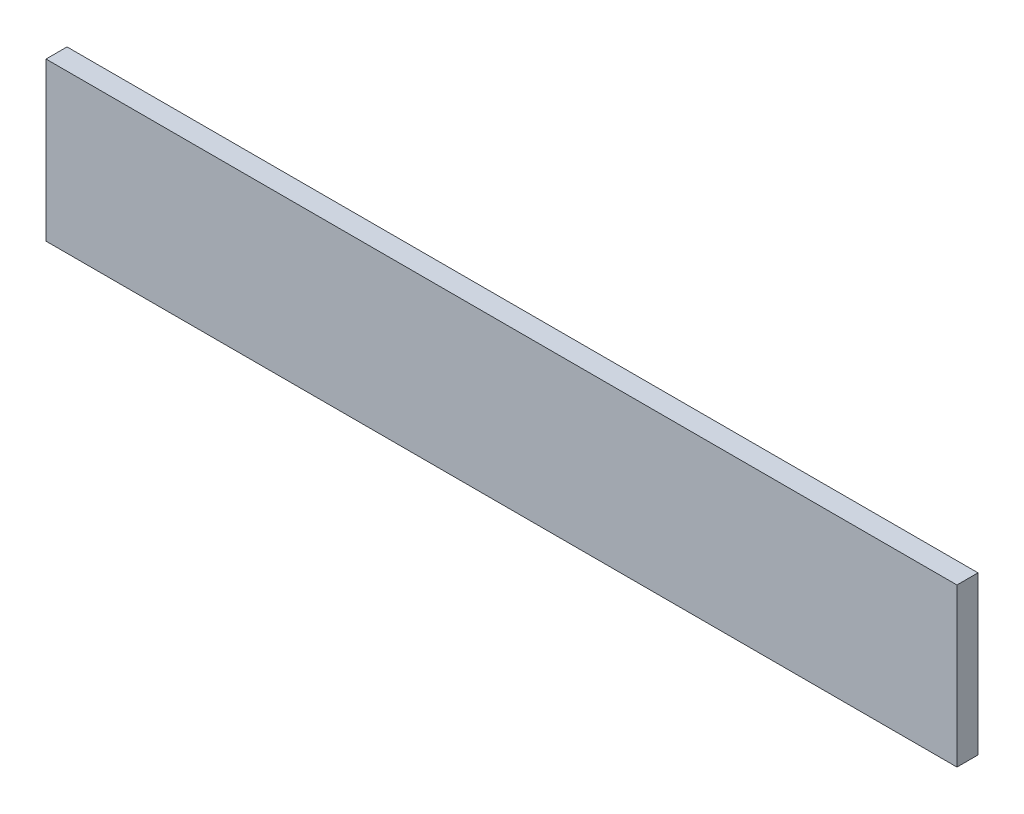
ISO-10303-21;
HEADER;
FILE_DESCRIPTION(('STEP AP214'),'2;1');
FILE_NAME('part.step','',(''),(''),'','','');
FILE_SCHEMA(('AUTOMOTIVE_DESIGN { 1 0 10303 214 1 1 1 1 }'));
ENDSEC;
DATA;
#1=APPLICATION_CONTEXT('core data for automotive mechanical design processes');
#2=APPLICATION_PROTOCOL_DEFINITION('international standard','automotive_design',2000,#1);
#3=PRODUCT_CONTEXT('',#1,'mechanical');
#4=PRODUCT('Part','Part','',(#3));
#5=PRODUCT_RELATED_PRODUCT_CATEGORY('part','',(#4));
#6=PRODUCT_DEFINITION_FORMATION('','',#4);
#7=PRODUCT_DEFINITION_CONTEXT('part definition',#1,'design');
#8=PRODUCT_DEFINITION('design','',#6,#7);
#9=PRODUCT_DEFINITION_SHAPE('','',#8);
#10=(LENGTH_UNIT() NAMED_UNIT(*) SI_UNIT(.MILLI.,.METRE.));
#11=(NAMED_UNIT(*) PLANE_ANGLE_UNIT() SI_UNIT($,.RADIAN.));
#12=(NAMED_UNIT(*) SI_UNIT($,.STERADIAN.) SOLID_ANGLE_UNIT());
#13=UNCERTAINTY_MEASURE_WITH_UNIT(LENGTH_MEASURE(1.E-05),#10,'distance_accuracy_value','');
#14=(GEOMETRIC_REPRESENTATION_CONTEXT(3) GLOBAL_UNCERTAINTY_ASSIGNED_CONTEXT((#13)) GLOBAL_UNIT_ASSIGNED_CONTEXT((#10,
#11,#12)) REPRESENTATION_CONTEXT('',''));
#15=CARTESIAN_POINT('',(0.,0.,0.));
#16=DIRECTION('',(0.,0.,1.));
#17=DIRECTION('',(1.,0.,0.));
#18=AXIS2_PLACEMENT_3D('',#15,#16,#17);
#19=CARTESIAN_POINT('',(-346.5,-60.,16.));
#20=DIRECTION('',(1.,0.,0.));
#21=DIRECTION('',(0.,0.,-1.));
#22=AXIS2_PLACEMENT_3D('',#19,#20,#21);
#23=PLANE('',#22);
#24=DIRECTION('',(0.,-1.,0.));
#25=VECTOR('',#24,1.);
#26=CARTESIAN_POINT('',(-346.5,-60.,0.));
#27=LINE('',#26,#25);
#28=CARTESIAN_POINT('',(-346.5,60.,0.));
#29=VERTEX_POINT('',#28);
#30=CARTESIAN_POINT('',(-346.5,-60.,0.));
#31=VERTEX_POINT('',#30);
#32=EDGE_CURVE('E98',#29,#31,#27,.T.);
#33=ORIENTED_EDGE('',*,*,#32,.T.);
#34=DIRECTION('',(0.,0.,-1.));
#35=VECTOR('',#34,1.);
#36=CARTESIAN_POINT('',(-346.5,-60.,16.));
#37=LINE('',#36,#35);
#38=CARTESIAN_POINT('',(-346.5,-60.,16.));
#39=VERTEX_POINT('',#38);
#40=EDGE_CURVE('E11',#39,#31,#37,.T.);
#41=ORIENTED_EDGE('',*,*,#40,.F.);
#42=DIRECTION('',(0.,-1.,0.));
#43=VECTOR('',#42,1.);
#44=CARTESIAN_POINT('',(-346.5,-60.,16.));
#45=LINE('',#44,#43);
#46=CARTESIAN_POINT('',(-346.5,60.,16.));
#47=VERTEX_POINT('',#46);
#48=EDGE_CURVE('E86',#47,#39,#45,.T.);
#49=ORIENTED_EDGE('',*,*,#48,.F.);
#50=DIRECTION('',(0.,0.,-1.));
#51=VECTOR('',#50,1.);
#52=CARTESIAN_POINT('',(-346.5,60.,16.));
#53=LINE('',#52,#51);
#54=EDGE_CURVE('E94',#47,#29,#53,.T.);
#55=ORIENTED_EDGE('',*,*,#54,.T.);
#56=EDGE_LOOP('',(#33,#41,#49,#55));
#57=FACE_BOUND('',#56,.T.);
#58=ADVANCED_FACE('F35',(#57),#23,.F.);
#59=CARTESIAN_POINT('',(346.5,-60.,16.));
#60=DIRECTION('',(0.,1.,0.));
#61=DIRECTION('',(-1.,0.,0.));
#62=AXIS2_PLACEMENT_3D('',#59,#60,#61);
#63=PLANE('',#62);
#64=DIRECTION('',(1.,0.,0.));
#65=VECTOR('',#64,1.);
#66=CARTESIAN_POINT('',(346.5,-60.,0.));
#67=LINE('',#66,#65);
#68=CARTESIAN_POINT('',(346.5,-60.,0.));
#69=VERTEX_POINT('',#68);
#70=EDGE_CURVE('E90',#31,#69,#67,.T.);
#71=ORIENTED_EDGE('',*,*,#70,.T.);
#72=DIRECTION('',(0.,0.,-1.));
#73=VECTOR('',#72,1.);
#74=CARTESIAN_POINT('',(346.5,-60.,16.));
#75=LINE('',#74,#73);
#76=CARTESIAN_POINT('',(346.5,-60.,16.));
#77=VERTEX_POINT('',#76);
#78=EDGE_CURVE('E43',#77,#69,#75,.T.);
#79=ORIENTED_EDGE('',*,*,#78,.F.);
#80=DIRECTION('',(1.,0.,0.));
#81=VECTOR('',#80,1.);
#82=CARTESIAN_POINT('',(346.5,-60.,16.));
#83=LINE('',#82,#81);
#84=EDGE_CURVE('E81',#39,#77,#83,.T.);
#85=ORIENTED_EDGE('',*,*,#84,.F.);
#86=ORIENTED_EDGE('',*,*,#40,.T.);
#87=EDGE_LOOP('',(#71,#79,#85,#86));
#88=FACE_BOUND('',#87,.T.);
#89=ADVANCED_FACE('F89',(#88),#63,.F.);
#90=CARTESIAN_POINT('',(346.5,-60.,16.));
#91=DIRECTION('',(-1.,0.,0.));
#92=DIRECTION('',(0.,0.,1.));
#93=AXIS2_PLACEMENT_3D('',#90,#91,#92);
#94=PLANE('',#93);
#95=DIRECTION('',(0.,1.,0.));
#96=VECTOR('',#95,1.);
#97=CARTESIAN_POINT('',(346.5,-60.,0.));
#98=LINE('',#97,#96);
#99=CARTESIAN_POINT('',(346.5,60.,0.));
#100=VERTEX_POINT('',#99);
#101=EDGE_CURVE('E68',#69,#100,#98,.T.);
#102=ORIENTED_EDGE('',*,*,#101,.T.);
#103=DIRECTION('',(0.,0.,-1.));
#104=VECTOR('',#103,1.);
#105=CARTESIAN_POINT('',(346.5,60.,16.));
#106=LINE('',#105,#104);
#107=CARTESIAN_POINT('',(346.5,60.,16.));
#108=VERTEX_POINT('',#107);
#109=EDGE_CURVE('E91',#108,#100,#106,.T.);
#110=ORIENTED_EDGE('',*,*,#109,.F.);
#111=DIRECTION('',(0.,1.,0.));
#112=VECTOR('',#111,1.);
#113=CARTESIAN_POINT('',(346.5,-60.,16.));
#114=LINE('',#113,#112);
#115=EDGE_CURVE('E84',#77,#108,#114,.T.);
#116=ORIENTED_EDGE('',*,*,#115,.F.);
#117=ORIENTED_EDGE('',*,*,#78,.T.);
#118=EDGE_LOOP('',(#102,#110,#116,#117));
#119=FACE_BOUND('',#118,.T.);
#120=ADVANCED_FACE('F92',(#119),#94,.F.);
#121=CARTESIAN_POINT('',(346.5,60.,16.));
#122=DIRECTION('',(0.,-1.,0.));
#123=DIRECTION('',(1.,0.,0.));
#124=AXIS2_PLACEMENT_3D('',#121,#122,#123);
#125=PLANE('',#124);
#126=DIRECTION('',(-1.,0.,0.));
#127=VECTOR('',#126,1.);
#128=CARTESIAN_POINT('',(346.5,60.,0.));
#129=LINE('',#128,#127);
#130=EDGE_CURVE('E74',#100,#29,#129,.T.);
#131=ORIENTED_EDGE('',*,*,#130,.T.);
#132=ORIENTED_EDGE('',*,*,#54,.F.);
#133=DIRECTION('',(-1.,0.,0.));
#134=VECTOR('',#133,1.);
#135=CARTESIAN_POINT('',(346.5,60.,16.));
#136=LINE('',#135,#134);
#137=EDGE_CURVE('E51',#108,#47,#136,.T.);
#138=ORIENTED_EDGE('',*,*,#137,.F.);
#139=ORIENTED_EDGE('',*,*,#109,.T.);
#140=EDGE_LOOP('',(#131,#132,#138,#139));
#141=FACE_BOUND('',#140,.T.);
#142=ADVANCED_FACE('F105',(#141),#125,.F.);
#143=CARTESIAN_POINT('',(0.,0.,16.));
#144=DIRECTION('',(0.,0.,1.));
#145=DIRECTION('',(1.,0.,0.));
#146=AXIS2_PLACEMENT_3D('',#143,#144,#145);
#147=PLANE('',#146);
#148=ORIENTED_EDGE('',*,*,#48,.T.);
#149=ORIENTED_EDGE('',*,*,#84,.T.);
#150=ORIENTED_EDGE('',*,*,#115,.T.);
#151=ORIENTED_EDGE('',*,*,#137,.T.);
#152=EDGE_LOOP('',(#148,#149,#150,#151));
#153=FACE_BOUND('',#152,.T.);
#154=ADVANCED_FACE('F82',(#153),#147,.T.);
#155=CARTESIAN_POINT('',(0.,0.,0.));
#156=DIRECTION('',(0.,0.,1.));
#157=DIRECTION('',(1.,0.,0.));
#158=AXIS2_PLACEMENT_3D('',#155,#156,#157);
#159=PLANE('',#158);
#160=ORIENTED_EDGE('',*,*,#32,.F.);
#161=ORIENTED_EDGE('',*,*,#130,.F.);
#162=ORIENTED_EDGE('',*,*,#101,.F.);
#163=ORIENTED_EDGE('',*,*,#70,.F.);
#164=EDGE_LOOP('',(#160,#161,#162,#163));
#165=FACE_BOUND('',#164,.T.);
#166=ADVANCED_FACE('F108',(#165),#159,.F.);
#167=CLOSED_SHELL('',(#58,#89,#120,#142,#154,#166));
#168=MANIFOLD_SOLID_BREP('B2',#167);
#169=ADVANCED_BREP_SHAPE_REPRESENTATION('',(#18,#168),#14);
#170=SHAPE_DEFINITION_REPRESENTATION(#9,#169);
ENDSEC;
END-ISO-10303-21;
